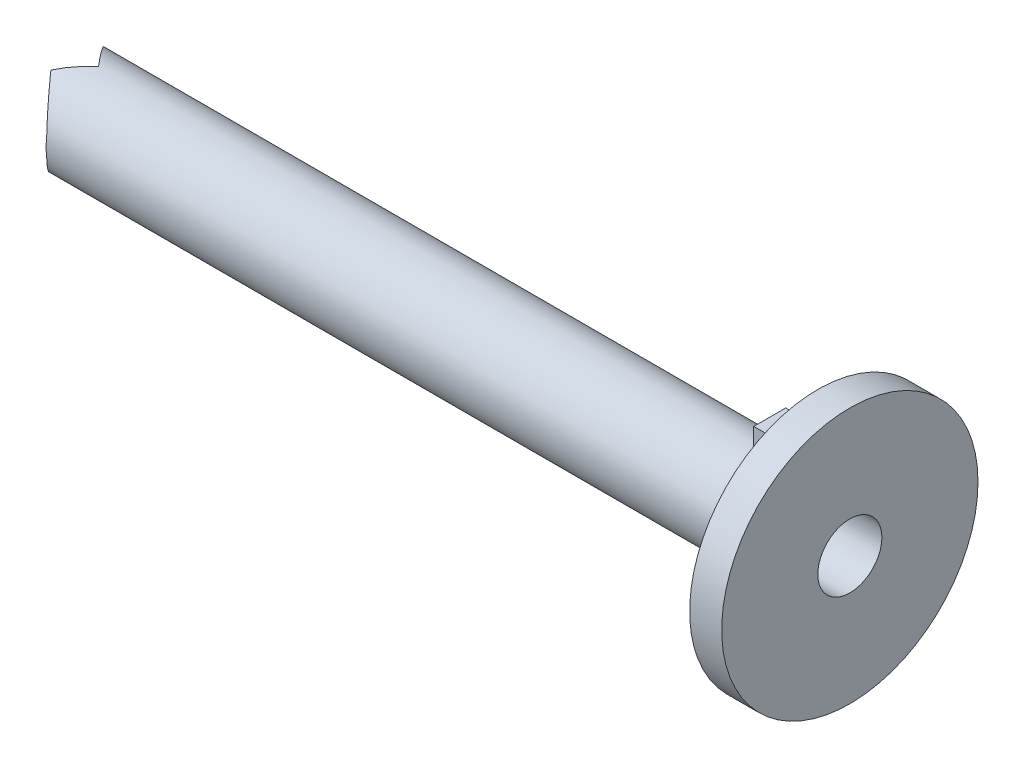
ISO-10303-21;
HEADER;
FILE_DESCRIPTION(('STEP AP214'),'2;1');
FILE_NAME('part.step','',(''),(''),'','','');
FILE_SCHEMA(('AUTOMOTIVE_DESIGN { 1 0 10303 214 1 1 1 1 }'));
ENDSEC;
DATA;
#1=APPLICATION_CONTEXT('core data for automotive mechanical design processes');
#2=APPLICATION_PROTOCOL_DEFINITION('international standard','automotive_design',2000,#1);
#3=PRODUCT_CONTEXT('',#1,'mechanical');
#4=PRODUCT('Part','Part','',(#3));
#5=PRODUCT_RELATED_PRODUCT_CATEGORY('part','',(#4));
#6=PRODUCT_DEFINITION_FORMATION('','',#4);
#7=PRODUCT_DEFINITION_CONTEXT('part definition',#1,'design');
#8=PRODUCT_DEFINITION('design','',#6,#7);
#9=PRODUCT_DEFINITION_SHAPE('','',#8);
#10=(LENGTH_UNIT() NAMED_UNIT(*) SI_UNIT(.MILLI.,.METRE.));
#11=(NAMED_UNIT(*) PLANE_ANGLE_UNIT() SI_UNIT($,.RADIAN.));
#12=(NAMED_UNIT(*) SI_UNIT($,.STERADIAN.) SOLID_ANGLE_UNIT());
#13=UNCERTAINTY_MEASURE_WITH_UNIT(LENGTH_MEASURE(1.E-05),#10,'distance_accuracy_value','');
#14=(GEOMETRIC_REPRESENTATION_CONTEXT(3) GLOBAL_UNCERTAINTY_ASSIGNED_CONTEXT((#13)) GLOBAL_UNIT_ASSIGNED_CONTEXT((#10,
#11,#12)) REPRESENTATION_CONTEXT('',''));
#15=CARTESIAN_POINT('',(0.,0.,0.));
#16=DIRECTION('',(0.,0.,1.));
#17=DIRECTION('',(1.,0.,0.));
#18=AXIS2_PLACEMENT_3D('',#15,#16,#17);
#19=CARTESIAN_POINT('',(-381.,0.,0.));
#20=DIRECTION('',(1.,0.,0.));
#21=DIRECTION('',(0.,0.,-1.));
#22=AXIS2_PLACEMENT_3D('',#19,#20,#21);
#23=CYLINDRICAL_SURFACE('',#22,19.05);
#24=DIRECTION('',(1.,0.,0.));
#25=VECTOR('',#24,1.);
#26=CARTESIAN_POINT('',(-381.,17.9605122421383,-6.35000000000002));
#27=LINE('',#26,#25);
#28=CARTESIAN_POINT('',(-31.75,17.9605122421383,-6.35));
#29=VERTEX_POINT('',#28);
#30=CARTESIAN_POINT('',(-19.05,17.9605122421402,-6.34999999999479));
#31=VERTEX_POINT('',#30);
#32=EDGE_CURVE('E64',#29,#31,#27,.T.);
#33=ORIENTED_EDGE('',*,*,#32,.T.);
#34=CARTESIAN_POINT('',(-19.05,0.,0.));
#35=DIRECTION('',(1.,0.,0.));
#36=DIRECTION('',(0.,0.,-1.));
#37=AXIS2_PLACEMENT_3D('',#34,#35,#36);
#38=CIRCLE('',#37,19.05);
#39=CARTESIAN_POINT('',(-19.05,17.9605122421549,6.35));
#40=VERTEX_POINT('',#39);
#41=EDGE_CURVE('E110',#31,#40,#38,.T.);
#42=ORIENTED_EDGE('',*,*,#41,.T.);
#43=DIRECTION('',(1.,0.,0.));
#44=VECTOR('',#43,1.);
#45=CARTESIAN_POINT('',(-381.,17.9605122421383,6.35));
#46=LINE('',#45,#44);
#47=CARTESIAN_POINT('',(-31.75,17.9605122421383,6.35));
#48=VERTEX_POINT('',#47);
#49=EDGE_CURVE('E113',#40,#48,#46,.F.);
#50=ORIENTED_EDGE('',*,*,#49,.T.);
#51=CARTESIAN_POINT('',(-31.75,0.,0.));
#52=DIRECTION('',(-1.,0.,0.));
#53=DIRECTION('',(0.,0.,1.));
#54=AXIS2_PLACEMENT_3D('',#51,#52,#53);
#55=CIRCLE('',#54,19.05);
#56=EDGE_CURVE('E60',#48,#29,#55,.T.);
#57=ORIENTED_EDGE('',*,*,#56,.T.);
#58=EDGE_LOOP('',(#33,#42,#50,#57));
#59=FACE_BOUND('',#58,.T.);
#60=CARTESIAN_POINT('',(-297.845785910603,0.,0.));
#61=DIRECTION('',(0.766757672993104,0.,-0.641936656459343));
#62=DIRECTION('',(0.641936656459343,0.,0.766757672993104));
#63=AXIS2_PLACEMENT_3D('',#60,#61,#62);
#64=ELLIPSE('',#63,24.8448769030725,19.05);
#65=CARTESIAN_POINT('',(-297.845785910603,19.05,0.));
#66=VERTEX_POINT('',#65);
#67=CARTESIAN_POINT('',(-297.845785910603,-19.05,0.));
#68=VERTEX_POINT('',#67);
#69=EDGE_CURVE('E162',#66,#68,#64,.F.);
#70=ORIENTED_EDGE('',*,*,#69,.F.);
#71=CARTESIAN_POINT('',(-297.845785910603,0.,0.));
#72=DIRECTION('',(0.641936656459343,0.,0.766757672993104));
#73=DIRECTION('',(0.766757672993104,0.,-0.641936656459343));
#74=AXIS2_PLACEMENT_3D('',#71,#72,#73);
#75=ELLIPSE('',#74,29.6758251897811,19.05);
#76=CARTESIAN_POINT('',(-308.119579729074,16.99764299198,8.60131575499901));
#77=VERTEX_POINT('',#76);
#78=EDGE_CURVE('E159',#77,#66,#75,.F.);
#79=ORIENTED_EDGE('',*,*,#78,.F.);
#80=CARTESIAN_POINT('',(-315.320681291399,0.,0.));
#81=DIRECTION('',(0.766757672993104,0.,-0.641936656459343));
#82=DIRECTION('',(0.641936656459343,0.,0.766757672993104));
#83=AXIS2_PLACEMENT_3D('',#80,#81,#82);
#84=ELLIPSE('',#83,24.8448769030725,19.05);
#85=CARTESIAN_POINT('',(-299.508024312462,2.48412502352422,18.8873402803968));
#86=VERTEX_POINT('',#85);
#87=EDGE_CURVE('E158',#86,#77,#84,.F.);
#88=ORIENTED_EDGE('',*,*,#87,.F.);
#89=CARTESIAN_POINT('',(-285.656063932512,0.,0.));
#90=DIRECTION('',(0.806379663794649,0.,0.591398205795747));
#91=DIRECTION('',(0.591398205795747,0.,-0.806379663794649));
#92=AXIS2_PLACEMENT_3D('',#89,#90,#91);
#93=ELLIPSE('',#92,23.6241076695248,19.05);
#94=CARTESIAN_POINT('',(-299.508024312462,-2.48412502352422,18.8873402803968));
#95=VERTEX_POINT('',#94);
#96=EDGE_CURVE('E12',#95,#86,#93,.F.);
#97=ORIENTED_EDGE('',*,*,#96,.F.);
#98=CARTESIAN_POINT('',(-308.119579729074,-16.99764299198,8.60131575499901));
#99=VERTEX_POINT('',#98);
#100=EDGE_CURVE('E155',#99,#95,#84,.F.);
#101=ORIENTED_EDGE('',*,*,#100,.F.);
#102=EDGE_CURVE('E161',#68,#99,#75,.F.);
#103=ORIENTED_EDGE('',*,*,#102,.F.);
#104=EDGE_LOOP('',(#70,#79,#88,#97,#101,#103));
#105=FACE_BOUND('',#104,.T.);
#106=CARTESIAN_POINT('',(-12.7,0.,0.));
#107=DIRECTION('',(1.,0.,0.));
#108=DIRECTION('',(0.,0.,-1.));
#109=AXIS2_PLACEMENT_3D('',#106,#107,#108);
#110=CIRCLE('',#109,19.05);
#111=CARTESIAN_POINT('',(-12.7,0.,-19.05));
#112=VERTEX_POINT('',#111);
#113=EDGE_CURVE('E168',#112,#112,#110,.F.);
#114=ORIENTED_EDGE('',*,*,#113,.T.);
#115=EDGE_LOOP('',(#114));
#116=FACE_BOUND('',#115,.T.);
#117=ADVANCED_FACE('F46',(#59,#105,#116),#23,.T.);
#118=CARTESIAN_POINT('',(0.,0.,0.));
#119=DIRECTION('',(1.,0.,0.));
#120=DIRECTION('',(0.,0.,-1.));
#121=AXIS2_PLACEMENT_3D('',#118,#119,#120);
#122=PLANE('',#121);
#123=CARTESIAN_POINT('',(0.,0.,0.));
#124=DIRECTION('',(1.,0.,0.));
#125=DIRECTION('',(0.,0.,-1.));
#126=AXIS2_PLACEMENT_3D('',#123,#124,#125);
#127=CIRCLE('',#126,12.7);
#128=CARTESIAN_POINT('',(0.,0.,-12.7));
#129=VERTEX_POINT('',#128);
#130=EDGE_CURVE('E173',#129,#129,#127,.T.);
#131=ORIENTED_EDGE('',*,*,#130,.F.);
#132=EDGE_LOOP('',(#131));
#133=FACE_BOUND('',#132,.T.);
#134=CARTESIAN_POINT('',(0.,0.,0.));
#135=DIRECTION('',(1.,0.,0.));
#136=DIRECTION('',(0.,0.,-1.));
#137=AXIS2_PLACEMENT_3D('',#134,#135,#136);
#138=CIRCLE('',#137,50.8);
#139=CARTESIAN_POINT('',(0.,0.,-50.8));
#140=VERTEX_POINT('',#139);
#141=EDGE_CURVE('E164',#140,#140,#138,.T.);
#142=ORIENTED_EDGE('',*,*,#141,.T.);
#143=EDGE_LOOP('',(#142));
#144=FACE_BOUND('',#143,.T.);
#145=ADVANCED_FACE('F218',(#133,#144),#122,.T.);
#146=CARTESIAN_POINT('',(-381.,0.,0.));
#147=DIRECTION('',(1.,0.,0.));
#148=DIRECTION('',(0.,0.,-1.));
#149=AXIS2_PLACEMENT_3D('',#146,#147,#148);
#150=CYLINDRICAL_SURFACE('',#149,12.7);
#151=CARTESIAN_POINT('',(-297.845785910603,0.,0.));
#152=DIRECTION('',(0.641936656459343,0.,0.766757672993104));
#153=DIRECTION('',(0.766757672993104,0.,-0.641936656459343));
#154=AXIS2_PLACEMENT_3D('',#151,#152,#153);
#155=ELLIPSE('',#154,19.783883459854,12.7);
#156=CARTESIAN_POINT('',(-308.119579729074,9.34384114177918,8.60131575499901));
#157=VERTEX_POINT('',#156);
#158=CARTESIAN_POINT('',(-297.845785910603,12.7,0.));
#159=VERTEX_POINT('',#158);
#160=EDGE_CURVE('E179',#157,#159,#155,.F.);
#161=ORIENTED_EDGE('',*,*,#160,.T.);
#162=CARTESIAN_POINT('',(-297.845785910603,0.,0.));
#163=DIRECTION('',(0.766757672993104,0.,-0.641936656459343));
#164=DIRECTION('',(0.641936656459343,0.,0.766757672993104));
#165=AXIS2_PLACEMENT_3D('',#162,#163,#164);
#166=ELLIPSE('',#165,16.563251268715,12.7);
#167=CARTESIAN_POINT('',(-297.845785910603,-12.7,0.));
#168=VERTEX_POINT('',#167);
#169=EDGE_CURVE('E53',#159,#168,#166,.F.);
#170=ORIENTED_EDGE('',*,*,#169,.T.);
#171=CARTESIAN_POINT('',(-308.119579729074,-9.34384114177921,8.60131575499901));
#172=VERTEX_POINT('',#171);
#173=EDGE_CURVE('E181',#168,#172,#155,.F.);
#174=ORIENTED_EDGE('',*,*,#173,.T.);
#175=CARTESIAN_POINT('',(-315.320681291399,0.,0.));
#176=DIRECTION('',(0.766757672993104,0.,-0.641936656459343));
#177=DIRECTION('',(0.641936656459343,0.,0.766757672993104));
#178=AXIS2_PLACEMENT_3D('',#175,#176,#177);
#179=ELLIPSE('',#178,16.563251268715,12.7);
#180=EDGE_CURVE('E176',#172,#157,#179,.F.);
#181=ORIENTED_EDGE('',*,*,#180,.T.);
#182=EDGE_LOOP('',(#161,#170,#174,#181));
#183=FACE_BOUND('',#182,.T.);
#184=ORIENTED_EDGE('',*,*,#130,.T.);
#185=EDGE_LOOP('',(#184));
#186=FACE_BOUND('',#185,.T.);
#187=ADVANCED_FACE('F185',(#183,#186),#150,.F.);
#188=CARTESIAN_POINT('',(-12.7,0.,0.));
#189=DIRECTION('',(1.,0.,0.));
#190=DIRECTION('',(0.,0.,-1.));
#191=AXIS2_PLACEMENT_3D('',#188,#189,#190);
#192=CYLINDRICAL_SURFACE('',#191,50.8);
#193=CARTESIAN_POINT('',(-12.7,0.,0.));
#194=DIRECTION('',(1.,0.,0.));
#195=DIRECTION('',(0.,0.,-1.));
#196=AXIS2_PLACEMENT_3D('',#193,#194,#195);
#197=CIRCLE('',#196,50.8);
#198=CARTESIAN_POINT('',(-12.7,0.,-50.8));
#199=VERTEX_POINT('',#198);
#200=EDGE_CURVE('E165',#199,#199,#197,.T.);
#201=ORIENTED_EDGE('',*,*,#200,.T.);
#202=EDGE_LOOP('',(#201));
#203=FACE_BOUND('',#202,.T.);
#204=ORIENTED_EDGE('',*,*,#141,.F.);
#205=EDGE_LOOP('',(#204));
#206=FACE_BOUND('',#205,.T.);
#207=ADVANCED_FACE('F256',(#203,#206),#192,.T.);
#208=CARTESIAN_POINT('',(-12.7,0.,0.));
#209=DIRECTION('',(1.,0.,0.));
#210=DIRECTION('',(0.,0.,-1.));
#211=AXIS2_PLACEMENT_3D('',#208,#209,#210);
#212=PLANE('',#211);
#213=ORIENTED_EDGE('',*,*,#113,.F.);
#214=EDGE_LOOP('',(#213));
#215=FACE_BOUND('',#214,.T.);
#216=ORIENTED_EDGE('',*,*,#200,.F.);
#217=EDGE_LOOP('',(#216));
#218=FACE_BOUND('',#217,.T.);
#219=ADVANCED_FACE('F252',(#215,#218),#212,.F.);
#220=CARTESIAN_POINT('',(-330.049521683784,-50.8,-38.4655732846327));
#221=DIRECTION('',(0.766757672993104,0.,-0.641936656459343));
#222=DIRECTION('',(-0.641936656459343,0.,-0.766757672993104));
#223=AXIS2_PLACEMENT_3D('',#220,#221,#222);
#224=PLANE('',#223);
#225=ORIENTED_EDGE('',*,*,#69,.T.);
#226=DIRECTION('',(0.,1.,0.));
#227=VECTOR('',#226,1.);
#228=CARTESIAN_POINT('',(-297.845785910603,-50.8,0.));
#229=LINE('',#228,#227);
#230=EDGE_CURVE('E147',#68,#168,#229,.T.);
#231=ORIENTED_EDGE('',*,*,#230,.T.);
#232=ORIENTED_EDGE('',*,*,#169,.F.);
#233=EDGE_CURVE('E144',#159,#66,#229,.T.);
#234=ORIENTED_EDGE('',*,*,#233,.T.);
#235=EDGE_LOOP('',(#225,#231,#232,#234));
#236=FACE_BOUND('',#235,.T.);
#237=ADVANCED_FACE('F195',(#236),#224,.F.);
#238=CARTESIAN_POINT('',(-297.845785910603,-50.8,0.));
#239=DIRECTION('',(0.641936656459343,0.,0.766757672993104));
#240=DIRECTION('',(0.766757672993104,0.,-0.641936656459343));
#241=AXIS2_PLACEMENT_3D('',#238,#239,#240);
#242=PLANE('',#241);
#243=ORIENTED_EDGE('',*,*,#102,.T.);
#244=DIRECTION('',(0.,1.,0.));
#245=VECTOR('',#244,1.);
#246=CARTESIAN_POINT('',(-308.119579729074,-50.8,8.60131575499901));
#247=LINE('',#246,#245);
#248=EDGE_CURVE('E148',#99,#172,#247,.T.);
#249=ORIENTED_EDGE('',*,*,#248,.T.);
#250=ORIENTED_EDGE('',*,*,#173,.F.);
#251=ORIENTED_EDGE('',*,*,#230,.F.);
#252=EDGE_LOOP('',(#243,#249,#250,#251));
#253=FACE_BOUND('',#252,.T.);
#254=ADVANCED_FACE('F191',(#253),#242,.F.);
#255=ORIENTED_EDGE('',*,*,#78,.T.);
#256=ORIENTED_EDGE('',*,*,#233,.F.);
#257=ORIENTED_EDGE('',*,*,#160,.F.);
#258=EDGE_CURVE('E149',#157,#77,#247,.T.);
#259=ORIENTED_EDGE('',*,*,#258,.T.);
#260=EDGE_LOOP('',(#255,#256,#257,#259));
#261=FACE_BOUND('',#260,.T.);
#262=ADVANCED_FACE('F207',(#261),#242,.F.);
#263=CARTESIAN_POINT('',(-308.119579729074,-50.8,8.60131575499901));
#264=DIRECTION('',(0.766757672993104,0.,-0.641936656459343));
#265=DIRECTION('',(-0.641936656459343,0.,-0.766757672993104));
#266=AXIS2_PLACEMENT_3D('',#263,#264,#265);
#267=PLANE('',#266);
#268=ORIENTED_EDGE('',*,*,#87,.T.);
#269=ORIENTED_EDGE('',*,*,#258,.F.);
#270=ORIENTED_EDGE('',*,*,#180,.F.);
#271=ORIENTED_EDGE('',*,*,#248,.F.);
#272=ORIENTED_EDGE('',*,*,#100,.T.);
#273=DIRECTION('',(0.,1.,0.));
#274=VECTOR('',#273,1.);
#275=CARTESIAN_POINT('',(-299.508024312462,-50.8,18.8873402803968));
#276=LINE('',#275,#274);
#277=EDGE_CURVE('E152',#95,#86,#276,.T.);
#278=ORIENTED_EDGE('',*,*,#277,.T.);
#279=EDGE_LOOP('',(#268,#269,#270,#271,#272,#278));
#280=FACE_BOUND('',#279,.T.);
#281=ADVANCED_FACE('F204',(#280),#267,.F.);
#282=CARTESIAN_POINT('',(-299.508024312462,-50.8,18.8873402803968));
#283=DIRECTION('',(0.806379663794649,0.,0.591398205795747));
#284=DIRECTION('',(0.591398205795747,0.,-0.806379663794649));
#285=AXIS2_PLACEMENT_3D('',#282,#283,#284);
#286=PLANE('',#285);
#287=ORIENTED_EDGE('',*,*,#96,.T.);
#288=ORIENTED_EDGE('',*,*,#277,.F.);
#289=EDGE_LOOP('',(#287,#288));
#290=FACE_BOUND('',#289,.T.);
#291=ADVANCED_FACE('F214',(#290),#286,.F.);
#292=CARTESIAN_POINT('',(-31.75,-500000.,-6.35));
#293=DIRECTION('',(0.,0.,-1.));
#294=DIRECTION('',(-1.,0.,0.));
#295=AXIS2_PLACEMENT_3D('',#292,#293,#294);
#296=PLANE('',#295);
#297=ORIENTED_EDGE('',*,*,#32,.F.);
#298=DIRECTION('',(0.,1.,0.));
#299=VECTOR('',#298,1.);
#300=CARTESIAN_POINT('',(-31.75,-500000.,-6.35));
#301=LINE('',#300,#299);
#302=CARTESIAN_POINT('',(-31.75,31.75,-6.35));
#303=VERTEX_POINT('',#302);
#304=EDGE_CURVE('E136',#29,#303,#301,.T.);
#305=ORIENTED_EDGE('',*,*,#304,.T.);
#306=DIRECTION('',(-1.,0.,0.));
#307=VECTOR('',#306,1.);
#308=CARTESIAN_POINT('',(-31.75,31.75,-6.35));
#309=LINE('',#308,#307);
#310=CARTESIAN_POINT('',(-19.05,31.75,-6.35));
#311=VERTEX_POINT('',#310);
#312=EDGE_CURVE('E362',#311,#303,#309,.T.);
#313=ORIENTED_EDGE('',*,*,#312,.F.);
#314=DIRECTION('',(0.,1.,0.));
#315=VECTOR('',#314,1.);
#316=CARTESIAN_POINT('',(-19.05,-500000.,-6.35));
#317=LINE('',#316,#315);
#318=EDGE_CURVE('E141',#31,#311,#317,.T.);
#319=ORIENTED_EDGE('',*,*,#318,.F.);
#320=EDGE_LOOP('',(#297,#305,#313,#319));
#321=FACE_BOUND('',#320,.T.);
#322=ADVANCED_FACE('F228',(#321),#296,.T.);
#323=CARTESIAN_POINT('',(-31.75,-500000.,6.35));
#324=DIRECTION('',(-1.,0.,0.));
#325=DIRECTION('',(0.,0.,1.));
#326=AXIS2_PLACEMENT_3D('',#323,#324,#325);
#327=PLANE('',#326);
#328=ORIENTED_EDGE('',*,*,#56,.F.);
#329=DIRECTION('',(0.,1.,0.));
#330=VECTOR('',#329,1.);
#331=CARTESIAN_POINT('',(-31.75,-500000.,6.35));
#332=LINE('',#331,#330);
#333=CARTESIAN_POINT('',(-31.75,31.75,6.35));
#334=VERTEX_POINT('',#333);
#335=EDGE_CURVE('E125',#48,#334,#332,.T.);
#336=ORIENTED_EDGE('',*,*,#335,.T.);
#337=DIRECTION('',(0.,0.,1.));
#338=VECTOR('',#337,1.);
#339=CARTESIAN_POINT('',(-31.75,31.75,6.35));
#340=LINE('',#339,#338);
#341=EDGE_CURVE('E360',#303,#334,#340,.T.);
#342=ORIENTED_EDGE('',*,*,#341,.F.);
#343=ORIENTED_EDGE('',*,*,#304,.F.);
#344=EDGE_LOOP('',(#328,#336,#342,#343));
#345=FACE_BOUND('',#344,.T.);
#346=ADVANCED_FACE('F236',(#345),#327,.T.);
#347=CARTESIAN_POINT('',(-19.05,31.75,-6.35));
#348=DIRECTION('',(0.,-1.,0.));
#349=DIRECTION('',(0.,0.,-1.));
#350=AXIS2_PLACEMENT_3D('',#347,#348,#349);
#351=PLANE('',#350);
#352=DIRECTION('',(0.,0.,-1.));
#353=VECTOR('',#352,1.);
#354=CARTESIAN_POINT('',(-19.05,31.75,6.35));
#355=LINE('',#354,#353);
#356=CARTESIAN_POINT('',(-19.05,31.75,6.35));
#357=VERTEX_POINT('',#356);
#358=EDGE_CURVE('E130',#357,#311,#355,.T.);
#359=ORIENTED_EDGE('',*,*,#358,.T.);
#360=ORIENTED_EDGE('',*,*,#312,.T.);
#361=ORIENTED_EDGE('',*,*,#341,.T.);
#362=DIRECTION('',(1.,0.,0.));
#363=VECTOR('',#362,1.);
#364=CARTESIAN_POINT('',(-31.75,31.75,6.35));
#365=LINE('',#364,#363);
#366=EDGE_CURVE('E134',#334,#357,#365,.T.);
#367=ORIENTED_EDGE('',*,*,#366,.T.);
#368=EDGE_LOOP('',(#359,#360,#361,#367));
#369=FACE_BOUND('',#368,.T.);
#370=CARTESIAN_POINT('',(-25.4,31.75,0.));
#371=DIRECTION('',(0.,1.,0.));
#372=DIRECTION('',(0.,0.,1.));
#373=AXIS2_PLACEMENT_3D('',#370,#371,#372);
#374=CIRCLE('',#373,2.286);
#375=CARTESIAN_POINT('',(-25.4,31.75,2.286));
#376=VERTEX_POINT('',#375);
#377=EDGE_CURVE('E131',#376,#376,#374,.T.);
#378=ORIENTED_EDGE('',*,*,#377,.F.);
#379=EDGE_LOOP('',(#378));
#380=FACE_BOUND('',#379,.T.);
#381=ADVANCED_FACE('F241',(#369,#380),#351,.F.);
#382=CARTESIAN_POINT('',(-25.4,-500000.,0.));
#383=DIRECTION('',(0.,1.,0.));
#384=DIRECTION('',(0.,0.,1.));
#385=AXIS2_PLACEMENT_3D('',#382,#383,#384);
#386=CYLINDRICAL_SURFACE('',#385,2.286);
#387=CARTESIAN_POINT('',(-25.4,18.9123426364901,2.286));
#388=CARTESIAN_POINT('',(-25.5279086655937,18.912344408558,2.28599453777581));
#389=CARTESIAN_POINT('',(-25.655898284354,18.9136542560225,2.2752284708381));
#390=CARTESIAN_POINT('',(-25.9083184743883,18.9187504146085,2.23244906856361));
#391=CARTESIAN_POINT('',(-26.032745137113,18.9225393442396,2.20041326672092));
#392=CARTESIAN_POINT('',(-26.2743480649944,18.93215846091,2.11604987977413));
#393=CARTESIAN_POINT('',(-26.3915290769839,18.9379872945147,2.06373574645827));
#394=CARTESIAN_POINT('',(-26.6154259222828,18.9510278203983,1.94032889219112));
#395=CARTESIAN_POINT('',(-26.7221436027753,18.9582392679255,1.86923949401544));
#396=CARTESIAN_POINT('',(-26.9226587059664,18.9732742241852,1.709906236747));
#397=CARTESIAN_POINT('',(-27.0163942482935,18.9811004032235,1.62158474704995));
#398=CARTESIAN_POINT('',(-27.1877500832395,18.9964589528062,1.43046134863374));
#399=CARTESIAN_POINT('',(-27.2653695884877,19.0039913089809,1.32765873283124));
#400=CARTESIAN_POINT('',(-27.4025104980974,19.0179406805588,1.1101041311726));
#401=CARTESIAN_POINT('',(-27.4619761267936,19.0243542332071,0.995316744832925));
#402=CARTESIAN_POINT('',(-27.5607641268132,19.0353140687346,0.757295234661848));
#403=CARTESIAN_POINT('',(-27.6000871896678,19.0398604157173,0.634061400977176));
#404=CARTESIAN_POINT('',(-27.6572895591508,19.0465547941289,0.383276747022628));
#405=CARTESIAN_POINT('',(-27.6752715379257,19.0487143051679,0.25574965693505));
#406=CARTESIAN_POINT('',(-27.6895993826746,19.0504308626969,-0.000529206461451134));
#407=CARTESIAN_POINT('',(-27.6859460368046,19.049988003989,-0.129280934987279));
#408=CARTESIAN_POINT('',(-27.6571894491493,19.0465590309053,-0.383656078648362));
#409=CARTESIAN_POINT('',(-27.632196624011,19.0435860085866,-0.509292177426982));
#410=CARTESIAN_POINT('',(-27.5616430083924,19.0354455273854,-0.75457383000948));
#411=CARTESIAN_POINT('',(-27.5160818530336,19.0302780295735,-0.874219277498467));
#412=CARTESIAN_POINT('',(-27.4055666805732,19.018306736327,-1.10446651592365));
#413=CARTESIAN_POINT('',(-27.3405646461631,19.0114988975783,-1.21504504052385));
#414=CARTESIAN_POINT('',(-27.1930477989954,18.9970090696977,-1.42376569719148));
#415=CARTESIAN_POINT('',(-27.1105322458713,18.9893270436166,-1.52190730322037));
#416=CARTESIAN_POINT('',(-26.9297116856502,18.9738919539915,-1.70361651495764));
#417=CARTESIAN_POINT('',(-26.8313104865934,18.9661387477997,-1.78708841625325));
#418=CARTESIAN_POINT('',(-26.6218429865762,18.9514830047109,-1.9363455697077));
#419=CARTESIAN_POINT('',(-26.5107766513167,18.9445804701177,-2.00213077396661));
#420=CARTESIAN_POINT('',(-26.2790489225077,18.9324075546074,-2.11415130909291));
#421=CARTESIAN_POINT('',(-26.1583839737615,18.927137782014,-2.16037935582123));
#422=CARTESIAN_POINT('',(-25.9109268220601,18.9188390969638,-2.23189045644672));
#423=CARTESIAN_POINT('',(-25.7841348907691,18.9158100852509,-2.25717443808216));
#424=CARTESIAN_POINT('',(-25.528867080561,18.9123538451915,-2.2859537367867));
#425=CARTESIAN_POINT('',(-25.4004065758586,18.9119105551203,-2.28958356614328));
#426=CARTESIAN_POINT('',(-25.1447080689977,18.9136334935473,-2.27530607718369));
#427=CARTESIAN_POINT('',(-25.0174700429222,18.9157996708879,-2.25739918108731));
#428=CARTESIAN_POINT('',(-24.7682290128983,18.9224828261534,-2.20066965459818));
#429=CARTESIAN_POINT('',(-24.6462110477313,18.9269925194845,-2.1619118242419));
#430=CARTESIAN_POINT('',(-24.4104063863723,18.9378486764175,-2.06464720515979));
#431=CARTESIAN_POINT('',(-24.2966199579687,18.9441951997416,-2.00613977429062));
#432=CARTESIAN_POINT('',(-24.0798987832293,18.9580484932734,-1.87070468673867));
#433=CARTESIAN_POINT('',(-23.9770196453964,18.965560769071,-1.79368861841805));
#434=CARTESIAN_POINT('',(-23.785600043885,18.9808816881761,-1.62354781591571));
#435=CARTESIAN_POINT('',(-23.6970600936647,18.988690342084,-1.53042250514038));
#436=CARTESIAN_POINT('',(-23.536361552607,19.0037733420022,-1.3301199757728));
#437=CARTESIAN_POINT('',(-23.4642912121583,19.0110446745095,-1.22287169655639));
#438=CARTESIAN_POINT('',(-23.3391876044912,19.0241889592544,-0.99771435921086));
#439=CARTESIAN_POINT('',(-23.2861539795107,19.0300619377709,-0.879805501481043));
#440=CARTESIAN_POINT('',(-23.2007757942846,19.0397343688052,-0.636970464476626));
#441=CARTESIAN_POINT('',(-23.1683797338482,19.0435389793403,-0.512062606033149));
#442=CARTESIAN_POINT('',(-23.1250286213904,19.0486673659754,-0.258531805763503));
#443=CARTESIAN_POINT('',(-23.1140726820798,19.0499912447393,-0.129909017901478));
#444=CARTESIAN_POINT('',(-23.1139284907864,19.0500086143069,0.126537724766815));
#445=CARTESIAN_POINT('',(-23.1246039640474,19.048718572432,0.254361623350063));
#446=CARTESIAN_POINT('',(-23.1671315586357,19.0436857176378,0.506384985294733));
#447=CARTESIAN_POINT('',(-23.1989836730215,19.0399429055226,0.630584449844191));
#448=CARTESIAN_POINT('',(-23.2829186475303,19.0304233070851,0.871819101659516));
#449=CARTESIAN_POINT('',(-23.3349955177143,19.0246471230312,0.988856398265975));
#450=CARTESIAN_POINT('',(-23.4578876050233,19.0117013041689,1.21255186282029));
#451=CARTESIAN_POINT('',(-23.528702973795,19.0045316580837,1.3192099467618));
#452=CARTESIAN_POINT('',(-23.6875678256888,18.9895459194044,1.51981622699742));
#453=CARTESIAN_POINT('',(-23.7757187847582,18.9817261850178,1.61368379412212));
#454=CARTESIAN_POINT('',(-23.9665431543102,18.9663512110822,1.78534870802855));
#455=CARTESIAN_POINT('',(-24.06922000815,18.9587960347779,1.86314223367572));
#456=CARTESIAN_POINT('',(-24.2865983173619,18.9447768836122,2.00068490943304));
#457=CARTESIAN_POINT('',(-24.4013413381441,18.938316895173,2.06036873828634));
#458=CARTESIAN_POINT('',(-24.639232728358,18.9272663651129,2.15953700037694));
#459=CARTESIAN_POINT('',(-24.7623717130524,18.9226737749139,2.19904358076641));
#460=CARTESIAN_POINT('',(-24.9718013687985,18.9170025954451,2.2471914167611));
#461=CARTESIAN_POINT('',(-25.056766816994,18.915263716976,2.2617239368575));
#462=CARTESIAN_POINT('',(-25.2278092842857,18.912933144869,2.28113003445061));
#463=CARTESIAN_POINT('',(-25.3138862958446,18.9123414434565,2.28600367740806));
#464=CARTESIAN_POINT('',(-25.4,18.9123426364901,2.286));
#465=B_SPLINE_CURVE_WITH_KNOTS('',3,(#387,#388,#389,#390,#391,#392,#393,#394,#395,#396,#397,
#398,#399,#400,#401,#402,#403,#404,#405,#406,#407,#408,#409,#410,#411,#412,#413,#414,#415,#416,
#417,#418,#419,#420,#421,#422,#423,#424,#425,#426,#427,#428,#429,#430,#431,#432,#433,#434,#435,
#436,#437,#438,#439,#440,#441,#442,#443,#444,#445,#446,#447,#448,#449,#450,#451,#452,#453,#454,
#455,#456,#457,#458,#459,#460,#461,#462,#463,#464),.UNSPECIFIED.,.T.,.F.,(4,2,2,2,2,2,2,2,2,2,2,
2,2,2,2,2,2,2,2,2,2,2,2,2,2,2,2,2,2,2,2,2,2,2,2,2,2,2,4),(0.,0.383411435283485,
0.767228500844914,1.15079139290421,1.53428644888261,1.91955079632443,2.30483396195011,
2.69128922058225,3.07773121060774,3.46230638920699,3.84686755815667,4.22945087174948,
4.61204097256711,4.99558395362745,5.37914315181536,5.76511860241567,6.15109509832199,
6.53721522637588,6.92331824993848,7.30702034215785,7.69071491215761,8.07322387614279,
8.45574527831597,8.84013154738718,9.22453157753644,9.61094544125029,9.99735204260287,
10.3827905654185,10.7682131367071,11.1512151515318,11.5342170408127,11.9171055833357,
12.2999972245899,12.6852007214437,13.0704956841091,13.457164313692,13.8434076071191,
14.1015386924649,14.3596680283826),.UNSPECIFIED.);
#466=CARTESIAN_POINT('',(-25.4,18.9123426364901,2.286));
#467=VERTEX_POINT('',#466);
#468=EDGE_CURVE('E117',#467,#467,#465,.T.);
#469=ORIENTED_EDGE('',*,*,#468,.T.);
#470=EDGE_LOOP('',(#469));
#471=FACE_BOUND('',#470,.T.);
#472=ORIENTED_EDGE('',*,*,#377,.T.);
#473=EDGE_LOOP('',(#472));
#474=FACE_BOUND('',#473,.T.);
#475=ADVANCED_FACE('F250',(#471,#474),#386,.F.);
#476=CARTESIAN_POINT('',(-19.05,-500000.,6.35));
#477=DIRECTION('',(1.,0.,0.));
#478=DIRECTION('',(0.,0.,-1.));
#479=AXIS2_PLACEMENT_3D('',#476,#477,#478);
#480=PLANE('',#479);
#481=ORIENTED_EDGE('',*,*,#41,.F.);
#482=ORIENTED_EDGE('',*,*,#318,.T.);
#483=ORIENTED_EDGE('',*,*,#358,.F.);
#484=DIRECTION('',(0.,1.,0.));
#485=VECTOR('',#484,1.);
#486=CARTESIAN_POINT('',(-19.05,-500000.,6.35));
#487=LINE('',#486,#485);
#488=EDGE_CURVE('E123',#40,#357,#487,.T.);
#489=ORIENTED_EDGE('',*,*,#488,.F.);
#490=EDGE_LOOP('',(#481,#482,#483,#489));
#491=FACE_BOUND('',#490,.T.);
#492=ADVANCED_FACE('F128',(#491),#480,.T.);
#493=CARTESIAN_POINT('',(-31.75,-500000.,6.35));
#494=DIRECTION('',(0.,0.,1.));
#495=DIRECTION('',(1.,0.,0.));
#496=AXIS2_PLACEMENT_3D('',#493,#494,#495);
#497=PLANE('',#496);
#498=ORIENTED_EDGE('',*,*,#49,.F.);
#499=ORIENTED_EDGE('',*,*,#488,.T.);
#500=ORIENTED_EDGE('',*,*,#366,.F.);
#501=ORIENTED_EDGE('',*,*,#335,.F.);
#502=EDGE_LOOP('',(#498,#499,#500,#501));
#503=FACE_BOUND('',#502,.T.);
#504=ADVANCED_FACE('F121',(#503),#497,.T.);
#505=ORIENTED_EDGE('',*,*,#468,.F.);
#506=EDGE_LOOP('',(#505));
#507=FACE_BOUND('',#506,.T.);
#508=ADVANCED_FACE('F219',(#507),#23,.T.);
#509=CLOSED_SHELL('',(#117,#145,#187,#207,#219,#237,#254,#262,#281,#291,#322,#346,#381,#475,
#492,#504,#508));
#510=MANIFOLD_SOLID_BREP('B2',#509);
#511=ADVANCED_BREP_SHAPE_REPRESENTATION('',(#18,#510),#14);
#512=SHAPE_DEFINITION_REPRESENTATION(#9,#511);
ENDSEC;
END-ISO-10303-21;
